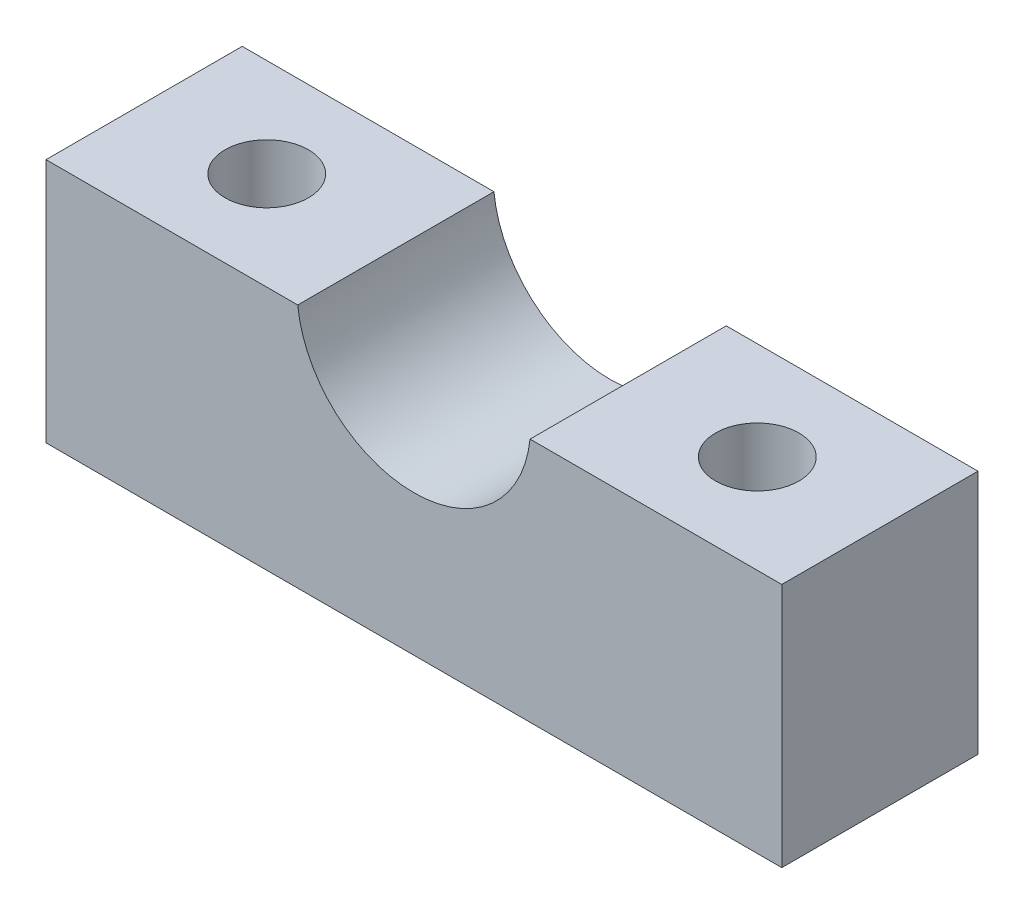
ISO-10303-21;
HEADER;
FILE_DESCRIPTION(('STEP AP214'),'2;1');
FILE_NAME('part.step','',(''),(''),'','','');
FILE_SCHEMA(('AUTOMOTIVE_DESIGN { 1 0 10303 214 1 1 1 1 }'));
ENDSEC;
DATA;
#1=APPLICATION_CONTEXT('core data for automotive mechanical design processes');
#2=APPLICATION_PROTOCOL_DEFINITION('international standard','automotive_design',2000,#1);
#3=PRODUCT_CONTEXT('',#1,'mechanical');
#4=PRODUCT('Part','Part','',(#3));
#5=PRODUCT_RELATED_PRODUCT_CATEGORY('part','',(#4));
#6=PRODUCT_DEFINITION_FORMATION('','',#4);
#7=PRODUCT_DEFINITION_CONTEXT('part definition',#1,'design');
#8=PRODUCT_DEFINITION('design','',#6,#7);
#9=PRODUCT_DEFINITION_SHAPE('','',#8);
#10=(LENGTH_UNIT() NAMED_UNIT(*) SI_UNIT(.MILLI.,.METRE.));
#11=(NAMED_UNIT(*) PLANE_ANGLE_UNIT() SI_UNIT($,.RADIAN.));
#12=(NAMED_UNIT(*) SI_UNIT($,.STERADIAN.) SOLID_ANGLE_UNIT());
#13=UNCERTAINTY_MEASURE_WITH_UNIT(LENGTH_MEASURE(1.E-05),#10,'distance_accuracy_value','');
#14=(GEOMETRIC_REPRESENTATION_CONTEXT(3) GLOBAL_UNCERTAINTY_ASSIGNED_CONTEXT((#13)) GLOBAL_UNIT_ASSIGNED_CONTEXT((#10,
#11,#12)) REPRESENTATION_CONTEXT('',''));
#15=CARTESIAN_POINT('',(0.,0.,0.));
#16=DIRECTION('',(0.,0.,1.));
#17=DIRECTION('',(1.,0.,0.));
#18=AXIS2_PLACEMENT_3D('',#15,#16,#17);
#19=CARTESIAN_POINT('',(15.,0.,4.));
#20=DIRECTION('',(0.,1.,0.));
#21=DIRECTION('',(0.,0.,1.));
#22=AXIS2_PLACEMENT_3D('',#19,#20,#21);
#23=PLANE('',#22);
#24=DIRECTION('',(0.,0.,1.));
#25=VECTOR('',#24,1.);
#26=CARTESIAN_POINT('',(-4.73618055504644,0.,-4.));
#27=LINE('',#26,#25);
#28=CARTESIAN_POINT('',(-4.73618055504644,0.,-4.));
#29=VERTEX_POINT('',#28);
#30=CARTESIAN_POINT('',(-4.73618055504644,0.,4.));
#31=VERTEX_POINT('',#30);
#32=EDGE_CURVE('E98',#29,#31,#27,.T.);
#33=ORIENTED_EDGE('',*,*,#32,.F.);
#34=DIRECTION('',(-1.,0.,0.));
#35=VECTOR('',#34,1.);
#36=CARTESIAN_POINT('',(-15.,0.,-4.));
#37=LINE('',#36,#35);
#38=CARTESIAN_POINT('',(-15.,0.,-4.));
#39=VERTEX_POINT('',#38);
#40=EDGE_CURVE('E104',#29,#39,#37,.T.);
#41=ORIENTED_EDGE('',*,*,#40,.T.);
#42=DIRECTION('',(0.,0.,1.));
#43=VECTOR('',#42,1.);
#44=CARTESIAN_POINT('',(-15.,0.,-4.));
#45=LINE('',#44,#43);
#46=CARTESIAN_POINT('',(-15.,0.,4.));
#47=VERTEX_POINT('',#46);
#48=EDGE_CURVE('E109',#39,#47,#45,.T.);
#49=ORIENTED_EDGE('',*,*,#48,.T.);
#50=DIRECTION('',(1.,0.,0.));
#51=VECTOR('',#50,1.);
#52=CARTESIAN_POINT('',(-15.,0.,4.));
#53=LINE('',#52,#51);
#54=EDGE_CURVE('E116',#47,#31,#53,.T.);
#55=ORIENTED_EDGE('',*,*,#54,.T.);
#56=EDGE_LOOP('',(#33,#41,#49,#55));
#57=FACE_BOUND('',#56,.T.);
#58=CARTESIAN_POINT('',(-10.,0.,0.));
#59=DIRECTION('',(0.,1.,0.));
#60=DIRECTION('',(0.,0.,1.));
#61=AXIS2_PLACEMENT_3D('',#58,#59,#60);
#62=CIRCLE('',#61,1.69999999999999);
#63=CARTESIAN_POINT('',(-10.,0.,1.69999999999999));
#64=VERTEX_POINT('',#63);
#65=EDGE_CURVE('E142',#64,#64,#62,.T.);
#66=ORIENTED_EDGE('',*,*,#65,.F.);
#67=EDGE_LOOP('',(#66));
#68=FACE_BOUND('',#67,.T.);
#69=ADVANCED_FACE('F32',(#57,#68),#23,.T.);
#70=CARTESIAN_POINT('',(15.,-10.,-4.));
#71=DIRECTION('',(1.,0.,0.));
#72=DIRECTION('',(0.,0.,-1.));
#73=AXIS2_PLACEMENT_3D('',#70,#71,#72);
#74=PLANE('',#73);
#75=DIRECTION('',(0.,0.,-1.));
#76=VECTOR('',#75,1.);
#77=CARTESIAN_POINT('',(15.,0.,-4.));
#78=LINE('',#77,#76);
#79=CARTESIAN_POINT('',(15.,0.,4.));
#80=VERTEX_POINT('',#79);
#81=CARTESIAN_POINT('',(15.,0.,-4.));
#82=VERTEX_POINT('',#81);
#83=EDGE_CURVE('E108',#80,#82,#78,.T.);
#84=ORIENTED_EDGE('',*,*,#83,.F.);
#85=DIRECTION('',(0.,1.,0.));
#86=VECTOR('',#85,1.);
#87=CARTESIAN_POINT('',(15.,-10.,4.));
#88=LINE('',#87,#86);
#89=CARTESIAN_POINT('',(15.,-10.,4.));
#90=VERTEX_POINT('',#89);
#91=EDGE_CURVE('E11',#90,#80,#88,.T.);
#92=ORIENTED_EDGE('',*,*,#91,.F.);
#93=DIRECTION('',(0.,0.,-1.));
#94=VECTOR('',#93,1.);
#95=CARTESIAN_POINT('',(15.,-10.,-4.));
#96=LINE('',#95,#94);
#97=CARTESIAN_POINT('',(15.,-10.,-4.));
#98=VERTEX_POINT('',#97);
#99=EDGE_CURVE('E118',#90,#98,#96,.T.);
#100=ORIENTED_EDGE('',*,*,#99,.T.);
#101=DIRECTION('',(0.,1.,0.));
#102=VECTOR('',#101,1.);
#103=CARTESIAN_POINT('',(15.,-10.,-4.));
#104=LINE('',#103,#102);
#105=EDGE_CURVE('E36',#98,#82,#104,.T.);
#106=ORIENTED_EDGE('',*,*,#105,.T.);
#107=EDGE_LOOP('',(#84,#92,#100,#106));
#108=FACE_BOUND('',#107,.T.);
#109=ADVANCED_FACE('F34',(#108),#74,.T.);
#110=CARTESIAN_POINT('',(-15.,-10.,4.));
#111=DIRECTION('',(0.,0.,1.));
#112=DIRECTION('',(1.,0.,0.));
#113=AXIS2_PLACEMENT_3D('',#110,#111,#112);
#114=PLANE('',#113);
#115=CARTESIAN_POINT('',(0.,0.500000000000001,4.));
#116=DIRECTION('',(0.,0.,1.));
#117=DIRECTION('',(1.,0.,0.));
#118=AXIS2_PLACEMENT_3D('',#115,#116,#117);
#119=CIRCLE('',#118,4.7625);
#120=CARTESIAN_POINT('',(4.73618055504644,0.,4.));
#121=VERTEX_POINT('',#120);
#122=EDGE_CURVE('E49',#31,#121,#119,.T.);
#123=ORIENTED_EDGE('',*,*,#122,.F.);
#124=ORIENTED_EDGE('',*,*,#54,.F.);
#125=DIRECTION('',(0.,1.,0.));
#126=VECTOR('',#125,1.);
#127=CARTESIAN_POINT('',(-15.,-10.,4.));
#128=LINE('',#127,#126);
#129=CARTESIAN_POINT('',(-15.,-10.,4.));
#130=VERTEX_POINT('',#129);
#131=EDGE_CURVE('E41',#130,#47,#128,.T.);
#132=ORIENTED_EDGE('',*,*,#131,.F.);
#133=DIRECTION('',(1.,0.,0.));
#134=VECTOR('',#133,1.);
#135=CARTESIAN_POINT('',(-15.,-10.,4.));
#136=LINE('',#135,#134);
#137=EDGE_CURVE('E122',#130,#90,#136,.T.);
#138=ORIENTED_EDGE('',*,*,#137,.T.);
#139=ORIENTED_EDGE('',*,*,#91,.T.);
#140=EDGE_CURVE('E78',#121,#80,#53,.T.);
#141=ORIENTED_EDGE('',*,*,#140,.F.);
#142=EDGE_LOOP('',(#123,#124,#132,#138,#139,#141));
#143=FACE_BOUND('',#142,.T.);
#144=ADVANCED_FACE('F148',(#143),#114,.T.);
#145=CARTESIAN_POINT('',(-15.,-10.,-4.));
#146=DIRECTION('',(-1.,0.,0.));
#147=DIRECTION('',(0.,0.,1.));
#148=AXIS2_PLACEMENT_3D('',#145,#146,#147);
#149=PLANE('',#148);
#150=ORIENTED_EDGE('',*,*,#48,.F.);
#151=DIRECTION('',(0.,1.,0.));
#152=VECTOR('',#151,1.);
#153=CARTESIAN_POINT('',(-15.,-10.,-4.));
#154=LINE('',#153,#152);
#155=CARTESIAN_POINT('',(-15.,-10.,-4.));
#156=VERTEX_POINT('',#155);
#157=EDGE_CURVE('E120',#156,#39,#154,.T.);
#158=ORIENTED_EDGE('',*,*,#157,.F.);
#159=DIRECTION('',(0.,0.,1.));
#160=VECTOR('',#159,1.);
#161=CARTESIAN_POINT('',(-15.,-10.,-4.));
#162=LINE('',#161,#160);
#163=EDGE_CURVE('E124',#156,#130,#162,.T.);
#164=ORIENTED_EDGE('',*,*,#163,.T.);
#165=ORIENTED_EDGE('',*,*,#131,.T.);
#166=EDGE_LOOP('',(#150,#158,#164,#165));
#167=FACE_BOUND('',#166,.T.);
#168=ADVANCED_FACE('F151',(#167),#149,.T.);
#169=CARTESIAN_POINT('',(-15.,-10.,-4.));
#170=DIRECTION('',(0.,0.,-1.));
#171=DIRECTION('',(-1.,0.,0.));
#172=AXIS2_PLACEMENT_3D('',#169,#170,#171);
#173=PLANE('',#172);
#174=CARTESIAN_POINT('',(0.,0.500000000000001,-4.));
#175=DIRECTION('',(0.,0.,1.));
#176=DIRECTION('',(1.,0.,0.));
#177=AXIS2_PLACEMENT_3D('',#174,#175,#176);
#178=CIRCLE('',#177,4.7625);
#179=CARTESIAN_POINT('',(4.73618055504644,0.,-4.));
#180=VERTEX_POINT('',#179);
#181=EDGE_CURVE('E95',#29,#180,#178,.T.);
#182=ORIENTED_EDGE('',*,*,#181,.T.);
#183=EDGE_CURVE('E102',#82,#180,#37,.T.);
#184=ORIENTED_EDGE('',*,*,#183,.F.);
#185=ORIENTED_EDGE('',*,*,#105,.F.);
#186=DIRECTION('',(-1.,0.,0.));
#187=VECTOR('',#186,1.);
#188=CARTESIAN_POINT('',(-15.,-10.,-4.));
#189=LINE('',#188,#187);
#190=EDGE_CURVE('E128',#98,#156,#189,.T.);
#191=ORIENTED_EDGE('',*,*,#190,.T.);
#192=ORIENTED_EDGE('',*,*,#157,.T.);
#193=ORIENTED_EDGE('',*,*,#40,.F.);
#194=EDGE_LOOP('',(#182,#184,#185,#191,#192,#193));
#195=FACE_BOUND('',#194,.T.);
#196=ADVANCED_FACE('F101',(#195),#173,.T.);
#197=CARTESIAN_POINT('',(15.,-10.,4.));
#198=DIRECTION('',(0.,1.,0.));
#199=DIRECTION('',(0.,0.,1.));
#200=AXIS2_PLACEMENT_3D('',#197,#198,#199);
#201=PLANE('',#200);
#202=CARTESIAN_POINT('',(-10.,-10.,0.));
#203=DIRECTION('',(0.,1.,0.));
#204=DIRECTION('',(0.,0.,1.));
#205=AXIS2_PLACEMENT_3D('',#202,#203,#204);
#206=CIRCLE('',#205,1.7);
#207=CARTESIAN_POINT('',(-10.,-10.,1.7));
#208=VERTEX_POINT('',#207);
#209=EDGE_CURVE('E139',#208,#208,#206,.T.);
#210=ORIENTED_EDGE('',*,*,#209,.T.);
#211=EDGE_LOOP('',(#210));
#212=FACE_BOUND('',#211,.T.);
#213=CARTESIAN_POINT('',(10.,-10.,0.));
#214=DIRECTION('',(0.,1.,0.));
#215=DIRECTION('',(0.,0.,1.));
#216=AXIS2_PLACEMENT_3D('',#213,#214,#215);
#217=CIRCLE('',#216,1.7);
#218=CARTESIAN_POINT('',(10.,-10.,1.7));
#219=VERTEX_POINT('',#218);
#220=EDGE_CURVE('E133',#219,#219,#217,.T.);
#221=ORIENTED_EDGE('',*,*,#220,.T.);
#222=EDGE_LOOP('',(#221));
#223=FACE_BOUND('',#222,.T.);
#224=ORIENTED_EDGE('',*,*,#99,.F.);
#225=ORIENTED_EDGE('',*,*,#137,.F.);
#226=ORIENTED_EDGE('',*,*,#163,.F.);
#227=ORIENTED_EDGE('',*,*,#190,.F.);
#228=EDGE_LOOP('',(#224,#225,#226,#227));
#229=FACE_BOUND('',#228,.T.);
#230=ADVANCED_FACE('F154',(#212,#223,#229),#201,.F.);
#231=DIRECTION('',(0.,0.,1.));
#232=VECTOR('',#231,1.);
#233=CARTESIAN_POINT('',(4.73618055504644,0.,-4.));
#234=LINE('',#233,#232);
#235=EDGE_CURVE('E92',#180,#121,#234,.T.);
#236=ORIENTED_EDGE('',*,*,#235,.T.);
#237=ORIENTED_EDGE('',*,*,#140,.T.);
#238=ORIENTED_EDGE('',*,*,#83,.T.);
#239=ORIENTED_EDGE('',*,*,#183,.T.);
#240=EDGE_LOOP('',(#236,#237,#238,#239));
#241=FACE_BOUND('',#240,.T.);
#242=CARTESIAN_POINT('',(10.,0.,0.));
#243=DIRECTION('',(0.,1.,0.));
#244=DIRECTION('',(0.,0.,1.));
#245=AXIS2_PLACEMENT_3D('',#242,#243,#244);
#246=CIRCLE('',#245,1.69999999999999);
#247=CARTESIAN_POINT('',(10.,0.,1.69999999999999));
#248=VERTEX_POINT('',#247);
#249=EDGE_CURVE('E136',#248,#248,#246,.T.);
#250=ORIENTED_EDGE('',*,*,#249,.F.);
#251=EDGE_LOOP('',(#250));
#252=FACE_BOUND('',#251,.T.);
#253=ADVANCED_FACE('F106',(#241,#252),#23,.T.);
#254=CARTESIAN_POINT('',(10.,0.,0.));
#255=DIRECTION('',(0.,1.,0.));
#256=DIRECTION('',(0.,0.,1.));
#257=AXIS2_PLACEMENT_3D('',#254,#255,#256);
#258=CYLINDRICAL_SURFACE('',#257,1.69999999999999);
#259=ORIENTED_EDGE('',*,*,#220,.F.);
#260=EDGE_LOOP('',(#259));
#261=FACE_BOUND('',#260,.T.);
#262=ORIENTED_EDGE('',*,*,#249,.T.);
#263=EDGE_LOOP('',(#262));
#264=FACE_BOUND('',#263,.T.);
#265=ADVANCED_FACE('F166',(#261,#264),#258,.F.);
#266=CARTESIAN_POINT('',(-10.,0.,0.));
#267=DIRECTION('',(0.,1.,0.));
#268=DIRECTION('',(0.,0.,1.));
#269=AXIS2_PLACEMENT_3D('',#266,#267,#268);
#270=CYLINDRICAL_SURFACE('',#269,1.69999999999999);
#271=ORIENTED_EDGE('',*,*,#209,.F.);
#272=EDGE_LOOP('',(#271));
#273=FACE_BOUND('',#272,.T.);
#274=ORIENTED_EDGE('',*,*,#65,.T.);
#275=EDGE_LOOP('',(#274));
#276=FACE_BOUND('',#275,.T.);
#277=ADVANCED_FACE('F171',(#273,#276),#270,.F.);
#278=CARTESIAN_POINT('',(0.,0.500000000000001,-4.));
#279=DIRECTION('',(0.,0.,1.));
#280=DIRECTION('',(1.,0.,0.));
#281=AXIS2_PLACEMENT_3D('',#278,#279,#280);
#282=CYLINDRICAL_SURFACE('',#281,4.7625);
#283=ORIENTED_EDGE('',*,*,#122,.T.);
#284=ORIENTED_EDGE('',*,*,#235,.F.);
#285=ORIENTED_EDGE('',*,*,#181,.F.);
#286=ORIENTED_EDGE('',*,*,#32,.T.);
#287=EDGE_LOOP('',(#283,#284,#285,#286));
#288=FACE_BOUND('',#287,.T.);
#289=ADVANCED_FACE('F94',(#288),#282,.F.);
#290=CLOSED_SHELL('',(#69,#109,#144,#168,#196,#230,#253,#265,#277,#289));
#291=MANIFOLD_SOLID_BREP('B2',#290);
#292=ADVANCED_BREP_SHAPE_REPRESENTATION('',(#18,#291),#14);
#293=SHAPE_DEFINITION_REPRESENTATION(#9,#292);
ENDSEC;
END-ISO-10303-21;
